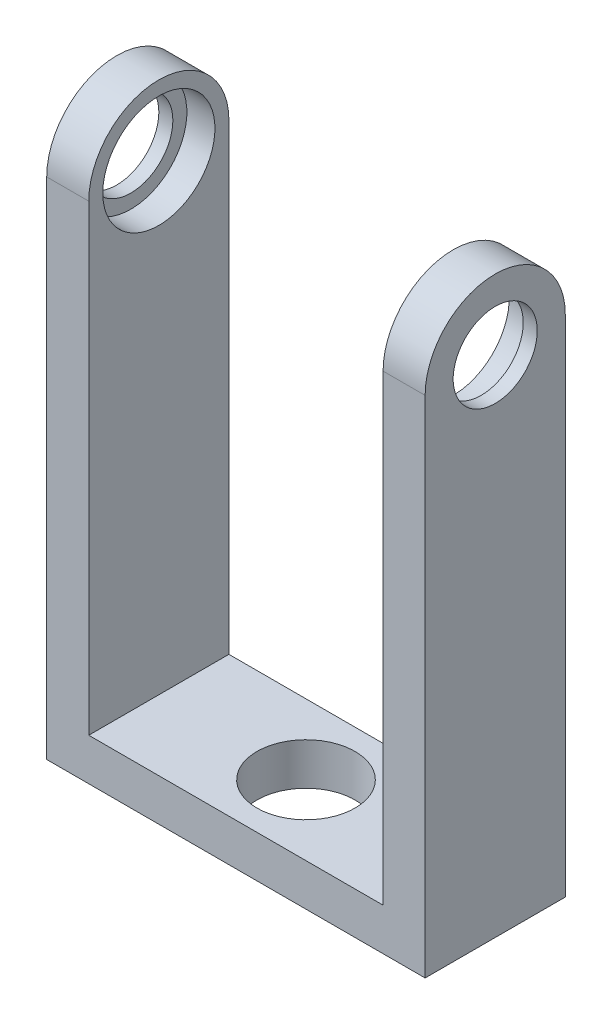
ISO-10303-21;
HEADER;
FILE_DESCRIPTION(('STEP AP214'),'2;1');
FILE_NAME('part.step','',(''),(''),'','','');
FILE_SCHEMA(('AUTOMOTIVE_DESIGN { 1 0 10303 214 1 1 1 1 }'));
ENDSEC;
DATA;
#1=APPLICATION_CONTEXT('core data for automotive mechanical design processes');
#2=APPLICATION_PROTOCOL_DEFINITION('international standard','automotive_design',2000,#1);
#3=PRODUCT_CONTEXT('',#1,'mechanical');
#4=PRODUCT('Part','Part','',(#3));
#5=PRODUCT_RELATED_PRODUCT_CATEGORY('part','',(#4));
#6=PRODUCT_DEFINITION_FORMATION('','',#4);
#7=PRODUCT_DEFINITION_CONTEXT('part definition',#1,'design');
#8=PRODUCT_DEFINITION('design','',#6,#7);
#9=PRODUCT_DEFINITION_SHAPE('','',#8);
#10=(LENGTH_UNIT() NAMED_UNIT(*) SI_UNIT(.MILLI.,.METRE.));
#11=(NAMED_UNIT(*) PLANE_ANGLE_UNIT() SI_UNIT($,.RADIAN.));
#12=(NAMED_UNIT(*) SI_UNIT($,.STERADIAN.) SOLID_ANGLE_UNIT());
#13=UNCERTAINTY_MEASURE_WITH_UNIT(LENGTH_MEASURE(1.E-05),#10,'distance_accuracy_value','');
#14=(GEOMETRIC_REPRESENTATION_CONTEXT(3) GLOBAL_UNCERTAINTY_ASSIGNED_CONTEXT((#13)) GLOBAL_UNIT_ASSIGNED_CONTEXT((#10,
#11,#12)) REPRESENTATION_CONTEXT('',''));
#15=CARTESIAN_POINT('',(0.,0.,0.));
#16=DIRECTION('',(0.,0.,1.));
#17=DIRECTION('',(1.,0.,0.));
#18=AXIS2_PLACEMENT_3D('',#15,#16,#17);
#19=CARTESIAN_POINT('',(-10.5,36.,0.));
#20=DIRECTION('',(-1.,0.,0.));
#21=DIRECTION('',(0.,0.,1.));
#22=AXIS2_PLACEMENT_3D('',#19,#20,#21);
#23=CYLINDRICAL_SURFACE('',#22,3.);
#24=CARTESIAN_POINT('',(-13.5,36.,0.));
#25=DIRECTION('',(1.,0.,0.));
#26=DIRECTION('',(0.,0.,-1.));
#27=AXIS2_PLACEMENT_3D('',#24,#25,#26);
#28=CIRCLE('',#27,3.);
#29=CARTESIAN_POINT('',(-13.5,36.,-3.));
#30=VERTEX_POINT('',#29);
#31=EDGE_CURVE('E135',#30,#30,#28,.T.);
#32=ORIENTED_EDGE('',*,*,#31,.F.);
#33=EDGE_LOOP('',(#32));
#34=FACE_BOUND('',#33,.T.);
#35=CARTESIAN_POINT('',(-12.5,36.,0.));
#36=DIRECTION('',(1.,0.,0.));
#37=DIRECTION('',(0.,0.,-1.));
#38=AXIS2_PLACEMENT_3D('',#35,#36,#37);
#39=CIRCLE('',#38,3.);
#40=CARTESIAN_POINT('',(-12.5,36.,-3.));
#41=VERTEX_POINT('',#40);
#42=EDGE_CURVE('E43',#41,#41,#39,.T.);
#43=ORIENTED_EDGE('',*,*,#42,.T.);
#44=EDGE_LOOP('',(#43));
#45=FACE_BOUND('',#44,.T.);
#46=ADVANCED_FACE('F39',(#34,#45),#23,.F.);
#47=CARTESIAN_POINT('',(10.5,36.,0.));
#48=DIRECTION('',(1.,0.,0.));
#49=DIRECTION('',(0.,0.,-1.));
#50=AXIS2_PLACEMENT_3D('',#47,#48,#49);
#51=CYLINDRICAL_SURFACE('',#50,3.);
#52=CARTESIAN_POINT('',(13.5,36.,0.));
#53=DIRECTION('',(1.,0.,0.));
#54=DIRECTION('',(0.,0.,-1.));
#55=AXIS2_PLACEMENT_3D('',#52,#53,#54);
#56=CIRCLE('',#55,3.);
#57=CARTESIAN_POINT('',(13.5,36.,-3.));
#58=VERTEX_POINT('',#57);
#59=EDGE_CURVE('E155',#58,#58,#56,.T.);
#60=ORIENTED_EDGE('',*,*,#59,.T.);
#61=EDGE_LOOP('',(#60));
#62=FACE_BOUND('',#61,.T.);
#63=CARTESIAN_POINT('',(12.5,36.,0.));
#64=DIRECTION('',(-1.,0.,0.));
#65=DIRECTION('',(0.,0.,1.));
#66=AXIS2_PLACEMENT_3D('',#63,#64,#65);
#67=CIRCLE('',#66,3.);
#68=CARTESIAN_POINT('',(12.5,36.,3.));
#69=VERTEX_POINT('',#68);
#70=EDGE_CURVE('E151',#69,#69,#67,.F.);
#71=ORIENTED_EDGE('',*,*,#70,.F.);
#72=EDGE_LOOP('',(#71));
#73=FACE_BOUND('',#72,.T.);
#74=ADVANCED_FACE('F216',(#62,#73),#51,.F.);
#75=CARTESIAN_POINT('',(13.5,3.,5.));
#76=DIRECTION('',(-1.,0.,0.));
#77=DIRECTION('',(0.,0.,1.));
#78=AXIS2_PLACEMENT_3D('',#75,#76,#77);
#79=PLANE('',#78);
#80=DIRECTION('',(0.,0.,-1.));
#81=VECTOR('',#80,1.);
#82=CARTESIAN_POINT('',(13.5,0.,5.));
#83=LINE('',#82,#81);
#84=CARTESIAN_POINT('',(13.5,0.,5.));
#85=VERTEX_POINT('',#84);
#86=CARTESIAN_POINT('',(13.5,0.,-5.));
#87=VERTEX_POINT('',#86);
#88=EDGE_CURVE('E182',#85,#87,#83,.T.);
#89=ORIENTED_EDGE('',*,*,#88,.T.);
#90=DIRECTION('',(0.,-1.,0.));
#91=VECTOR('',#90,1.);
#92=CARTESIAN_POINT('',(13.5,3.,-5.));
#93=LINE('',#92,#91);
#94=CARTESIAN_POINT('',(13.5,36.,-5.));
#95=VERTEX_POINT('',#94);
#96=EDGE_CURVE('E11',#95,#87,#93,.T.);
#97=ORIENTED_EDGE('',*,*,#96,.F.);
#98=CARTESIAN_POINT('',(13.5,36.,0.));
#99=DIRECTION('',(1.,0.,0.));
#100=DIRECTION('',(0.,0.,1.));
#101=AXIS2_PLACEMENT_3D('',#98,#99,#100);
#102=CIRCLE('',#101,5.);
#103=CARTESIAN_POINT('',(13.5,36.,5.));
#104=VERTEX_POINT('',#103);
#105=EDGE_CURVE('E159',#95,#104,#102,.T.);
#106=ORIENTED_EDGE('',*,*,#105,.T.);
#107=DIRECTION('',(0.,-1.,0.));
#108=VECTOR('',#107,1.);
#109=CARTESIAN_POINT('',(13.5,3.,5.));
#110=LINE('',#109,#108);
#111=EDGE_CURVE('E191',#104,#85,#110,.T.);
#112=ORIENTED_EDGE('',*,*,#111,.T.);
#113=EDGE_LOOP('',(#89,#97,#106,#112));
#114=FACE_BOUND('',#113,.T.);
#115=ORIENTED_EDGE('',*,*,#59,.F.);
#116=EDGE_LOOP('',(#115));
#117=FACE_BOUND('',#116,.T.);
#118=ADVANCED_FACE('F41',(#114,#117),#79,.F.);
#119=CARTESIAN_POINT('',(-13.5,3.,-5.));
#120=DIRECTION('',(0.,0.,1.));
#121=DIRECTION('',(1.,0.,0.));
#122=AXIS2_PLACEMENT_3D('',#119,#120,#121);
#123=PLANE('',#122);
#124=DIRECTION('',(-1.,0.,0.));
#125=VECTOR('',#124,1.);
#126=CARTESIAN_POINT('',(-13.5,3.,-5.));
#127=LINE('',#126,#125);
#128=CARTESIAN_POINT('',(10.5,3.,-5.));
#129=VERTEX_POINT('',#128);
#130=CARTESIAN_POINT('',(-10.5,3.,-5.));
#131=VERTEX_POINT('',#130);
#132=EDGE_CURVE('E57',#129,#131,#127,.T.);
#133=ORIENTED_EDGE('',*,*,#132,.F.);
#134=DIRECTION('',(0.,1.,0.));
#135=VECTOR('',#134,1.);
#136=CARTESIAN_POINT('',(10.5,3.,-5.));
#137=LINE('',#136,#135);
#138=CARTESIAN_POINT('',(10.5,36.,-5.));
#139=VERTEX_POINT('',#138);
#140=EDGE_CURVE('E166',#129,#139,#137,.T.);
#141=ORIENTED_EDGE('',*,*,#140,.T.);
#142=DIRECTION('',(1.,0.,0.));
#143=VECTOR('',#142,1.);
#144=CARTESIAN_POINT('',(10.5,36.,-5.));
#145=LINE('',#144,#143);
#146=EDGE_CURVE('E174',#139,#95,#145,.T.);
#147=ORIENTED_EDGE('',*,*,#146,.T.);
#148=ORIENTED_EDGE('',*,*,#96,.T.);
#149=DIRECTION('',(-1.,0.,0.));
#150=VECTOR('',#149,1.);
#151=CARTESIAN_POINT('',(-13.5,0.,-5.));
#152=LINE('',#151,#150);
#153=CARTESIAN_POINT('',(-13.5,0.,-5.));
#154=VERTEX_POINT('',#153);
#155=EDGE_CURVE('E195',#87,#154,#152,.T.);
#156=ORIENTED_EDGE('',*,*,#155,.T.);
#157=DIRECTION('',(0.,-1.,0.));
#158=VECTOR('',#157,1.);
#159=CARTESIAN_POINT('',(-13.5,3.,-5.));
#160=LINE('',#159,#158);
#161=CARTESIAN_POINT('',(-13.5,36.,-5.));
#162=VERTEX_POINT('',#161);
#163=EDGE_CURVE('E49',#162,#154,#160,.T.);
#164=ORIENTED_EDGE('',*,*,#163,.F.);
#165=DIRECTION('',(-1.,0.,0.));
#166=VECTOR('',#165,1.);
#167=CARTESIAN_POINT('',(-10.5,36.,-5.));
#168=LINE('',#167,#166);
#169=CARTESIAN_POINT('',(-10.5,36.,-5.));
#170=VERTEX_POINT('',#169);
#171=EDGE_CURVE('E126',#170,#162,#168,.T.);
#172=ORIENTED_EDGE('',*,*,#171,.F.);
#173=DIRECTION('',(0.,1.,0.));
#174=VECTOR('',#173,1.);
#175=CARTESIAN_POINT('',(-10.5,3.,-5.));
#176=LINE('',#175,#174);
#177=EDGE_CURVE('E111',#131,#170,#176,.T.);
#178=ORIENTED_EDGE('',*,*,#177,.F.);
#179=EDGE_LOOP('',(#133,#141,#147,#148,#156,#164,#172,#178));
#180=FACE_BOUND('',#179,.T.);
#181=ADVANCED_FACE('F224',(#180),#123,.F.);
#182=CARTESIAN_POINT('',(-13.5,3.,5.));
#183=DIRECTION('',(1.,0.,0.));
#184=DIRECTION('',(0.,0.,-1.));
#185=AXIS2_PLACEMENT_3D('',#182,#183,#184);
#186=PLANE('',#185);
#187=DIRECTION('',(0.,0.,1.));
#188=VECTOR('',#187,1.);
#189=CARTESIAN_POINT('',(-13.5,0.,5.));
#190=LINE('',#189,#188);
#191=CARTESIAN_POINT('',(-13.5,0.,5.));
#192=VERTEX_POINT('',#191);
#193=EDGE_CURVE('E198',#154,#192,#190,.T.);
#194=ORIENTED_EDGE('',*,*,#193,.T.);
#195=DIRECTION('',(0.,-1.,0.));
#196=VECTOR('',#195,1.);
#197=CARTESIAN_POINT('',(-13.5,3.,5.));
#198=LINE('',#197,#196);
#199=CARTESIAN_POINT('',(-13.5,36.,5.));
#200=VERTEX_POINT('',#199);
#201=EDGE_CURVE('E205',#200,#192,#198,.T.);
#202=ORIENTED_EDGE('',*,*,#201,.F.);
#203=CARTESIAN_POINT('',(-13.5,36.,0.));
#204=DIRECTION('',(1.,0.,0.));
#205=DIRECTION('',(0.,0.,1.));
#206=AXIS2_PLACEMENT_3D('',#203,#204,#205);
#207=CIRCLE('',#206,5.);
#208=EDGE_CURVE('E122',#162,#200,#207,.T.);
#209=ORIENTED_EDGE('',*,*,#208,.F.);
#210=ORIENTED_EDGE('',*,*,#163,.T.);
#211=EDGE_LOOP('',(#194,#202,#209,#210));
#212=FACE_BOUND('',#211,.T.);
#213=ORIENTED_EDGE('',*,*,#31,.T.);
#214=EDGE_LOOP('',(#213));
#215=FACE_BOUND('',#214,.T.);
#216=ADVANCED_FACE('F250',(#212,#215),#186,.F.);
#217=CARTESIAN_POINT('',(-13.5,3.,5.));
#218=DIRECTION('',(0.,0.,-1.));
#219=DIRECTION('',(-1.,0.,0.));
#220=AXIS2_PLACEMENT_3D('',#217,#218,#219);
#221=PLANE('',#220);
#222=DIRECTION('',(1.,0.,0.));
#223=VECTOR('',#222,1.);
#224=CARTESIAN_POINT('',(-13.5,0.,5.));
#225=LINE('',#224,#223);
#226=EDGE_CURVE('E188',#192,#85,#225,.T.);
#227=ORIENTED_EDGE('',*,*,#226,.T.);
#228=ORIENTED_EDGE('',*,*,#111,.F.);
#229=DIRECTION('',(1.,0.,0.));
#230=VECTOR('',#229,1.);
#231=CARTESIAN_POINT('',(10.5,36.,5.));
#232=LINE('',#231,#230);
#233=CARTESIAN_POINT('',(10.5,36.,5.));
#234=VERTEX_POINT('',#233);
#235=EDGE_CURVE('E178',#234,#104,#232,.T.);
#236=ORIENTED_EDGE('',*,*,#235,.F.);
#237=DIRECTION('',(0.,-1.,0.));
#238=VECTOR('',#237,1.);
#239=CARTESIAN_POINT('',(10.5,3.,5.));
#240=LINE('',#239,#238);
#241=CARTESIAN_POINT('',(10.5,3.,5.));
#242=VERTEX_POINT('',#241);
#243=EDGE_CURVE('E160',#234,#242,#240,.T.);
#244=ORIENTED_EDGE('',*,*,#243,.T.);
#245=DIRECTION('',(1.,0.,0.));
#246=VECTOR('',#245,1.);
#247=CARTESIAN_POINT('',(-13.5,3.,5.));
#248=LINE('',#247,#246);
#249=CARTESIAN_POINT('',(-10.5,3.,5.));
#250=VERTEX_POINT('',#249);
#251=EDGE_CURVE('E131',#250,#242,#248,.T.);
#252=ORIENTED_EDGE('',*,*,#251,.F.);
#253=DIRECTION('',(0.,-1.,0.));
#254=VECTOR('',#253,1.);
#255=CARTESIAN_POINT('',(-10.5,3.,5.));
#256=LINE('',#255,#254);
#257=CARTESIAN_POINT('',(-10.5,36.,5.));
#258=VERTEX_POINT('',#257);
#259=EDGE_CURVE('E109',#258,#250,#256,.T.);
#260=ORIENTED_EDGE('',*,*,#259,.F.);
#261=DIRECTION('',(-1.,0.,0.));
#262=VECTOR('',#261,1.);
#263=CARTESIAN_POINT('',(-10.5,36.,5.));
#264=LINE('',#263,#262);
#265=EDGE_CURVE('E119',#258,#200,#264,.T.);
#266=ORIENTED_EDGE('',*,*,#265,.T.);
#267=ORIENTED_EDGE('',*,*,#201,.T.);
#268=EDGE_LOOP('',(#227,#228,#236,#244,#252,#260,#266,#267));
#269=FACE_BOUND('',#268,.T.);
#270=ADVANCED_FACE('F129',(#269),#221,.F.);
#271=CARTESIAN_POINT('',(0.,3.,0.));
#272=DIRECTION('',(0.,-1.,0.));
#273=DIRECTION('',(0.,0.,-1.));
#274=AXIS2_PLACEMENT_3D('',#271,#272,#273);
#275=PLANE('',#274);
#276=CARTESIAN_POINT('',(0.,3.,0.));
#277=DIRECTION('',(0.,1.,0.));
#278=DIRECTION('',(0.,0.,1.));
#279=AXIS2_PLACEMENT_3D('',#276,#277,#278);
#280=CIRCLE('',#279,3.5);
#281=CARTESIAN_POINT('',(0.,3.,3.5));
#282=VERTEX_POINT('',#281);
#283=EDGE_CURVE('E288',#282,#282,#280,.T.);
#284=ORIENTED_EDGE('',*,*,#283,.F.);
#285=EDGE_LOOP('',(#284));
#286=FACE_BOUND('',#285,.T.);
#287=ORIENTED_EDGE('',*,*,#132,.T.);
#288=DIRECTION('',(0.,0.,-1.));
#289=VECTOR('',#288,1.);
#290=CARTESIAN_POINT('',(-10.5,3.,5.));
#291=LINE('',#290,#289);
#292=EDGE_CURVE('E61',#250,#131,#291,.T.);
#293=ORIENTED_EDGE('',*,*,#292,.F.);
#294=ORIENTED_EDGE('',*,*,#251,.T.);
#295=DIRECTION('',(0.,0.,-1.));
#296=VECTOR('',#295,1.);
#297=CARTESIAN_POINT('',(10.5,3.,5.));
#298=LINE('',#297,#296);
#299=EDGE_CURVE('E163',#242,#129,#298,.T.);
#300=ORIENTED_EDGE('',*,*,#299,.T.);
#301=EDGE_LOOP('',(#287,#293,#294,#300));
#302=FACE_BOUND('',#301,.T.);
#303=ADVANCED_FACE('F241',(#286,#302),#275,.F.);
#304=CARTESIAN_POINT('',(0.,0.,0.));
#305=DIRECTION('',(0.,-1.,0.));
#306=DIRECTION('',(0.,0.,-1.));
#307=AXIS2_PLACEMENT_3D('',#304,#305,#306);
#308=PLANE('',#307);
#309=CARTESIAN_POINT('',(0.,0.,0.));
#310=DIRECTION('',(0.,1.,0.));
#311=DIRECTION('',(0.,0.,1.));
#312=AXIS2_PLACEMENT_3D('',#309,#310,#311);
#313=CIRCLE('',#312,3.5);
#314=CARTESIAN_POINT('',(0.,0.,3.5));
#315=VERTEX_POINT('',#314);
#316=EDGE_CURVE('E286',#315,#315,#313,.T.);
#317=ORIENTED_EDGE('',*,*,#316,.T.);
#318=EDGE_LOOP('',(#317));
#319=FACE_BOUND('',#318,.T.);
#320=ORIENTED_EDGE('',*,*,#88,.F.);
#321=ORIENTED_EDGE('',*,*,#226,.F.);
#322=ORIENTED_EDGE('',*,*,#193,.F.);
#323=ORIENTED_EDGE('',*,*,#155,.F.);
#324=EDGE_LOOP('',(#320,#321,#322,#323));
#325=FACE_BOUND('',#324,.T.);
#326=ADVANCED_FACE('F239',(#319,#325),#308,.T.);
#327=CARTESIAN_POINT('',(10.5,36.,0.));
#328=DIRECTION('',(1.,0.,0.));
#329=DIRECTION('',(0.,0.,-1.));
#330=AXIS2_PLACEMENT_3D('',#327,#328,#329);
#331=CYLINDRICAL_SURFACE('',#330,5.);
#332=ORIENTED_EDGE('',*,*,#105,.F.);
#333=ORIENTED_EDGE('',*,*,#146,.F.);
#334=CARTESIAN_POINT('',(10.5,36.,0.));
#335=DIRECTION('',(1.,0.,0.));
#336=DIRECTION('',(0.,0.,1.));
#337=AXIS2_PLACEMENT_3D('',#334,#335,#336);
#338=CIRCLE('',#337,5.);
#339=EDGE_CURVE('E170',#139,#234,#338,.T.);
#340=ORIENTED_EDGE('',*,*,#339,.T.);
#341=ORIENTED_EDGE('',*,*,#235,.T.);
#342=EDGE_LOOP('',(#332,#333,#340,#341));
#343=FACE_BOUND('',#342,.T.);
#344=ADVANCED_FACE('F235',(#343),#331,.T.);
#345=CARTESIAN_POINT('',(10.5,36.,0.));
#346=DIRECTION('',(-1.,0.,0.));
#347=DIRECTION('',(0.,0.,1.));
#348=AXIS2_PLACEMENT_3D('',#345,#346,#347);
#349=PLANE('',#348);
#350=CARTESIAN_POINT('',(10.5,36.,0.));
#351=DIRECTION('',(-1.,0.,0.));
#352=DIRECTION('',(0.,0.,1.));
#353=AXIS2_PLACEMENT_3D('',#350,#351,#352);
#354=CIRCLE('',#353,4.);
#355=CARTESIAN_POINT('',(10.5,36.,4.));
#356=VERTEX_POINT('',#355);
#357=EDGE_CURVE('E145',#356,#356,#354,.T.);
#358=ORIENTED_EDGE('',*,*,#357,.F.);
#359=EDGE_LOOP('',(#358));
#360=FACE_BOUND('',#359,.T.);
#361=ORIENTED_EDGE('',*,*,#243,.F.);
#362=ORIENTED_EDGE('',*,*,#339,.F.);
#363=ORIENTED_EDGE('',*,*,#140,.F.);
#364=ORIENTED_EDGE('',*,*,#299,.F.);
#365=EDGE_LOOP('',(#361,#362,#363,#364));
#366=FACE_BOUND('',#365,.T.);
#367=ADVANCED_FACE('F232',(#360,#366),#349,.T.);
#368=CARTESIAN_POINT('',(12.5,36.,0.));
#369=DIRECTION('',(-1.,0.,0.));
#370=DIRECTION('',(0.,0.,1.));
#371=AXIS2_PLACEMENT_3D('',#368,#369,#370);
#372=PLANE('',#371);
#373=CARTESIAN_POINT('',(12.5,36.,0.));
#374=DIRECTION('',(-1.,0.,0.));
#375=DIRECTION('',(0.,0.,1.));
#376=AXIS2_PLACEMENT_3D('',#373,#374,#375);
#377=CIRCLE('',#376,4.);
#378=CARTESIAN_POINT('',(12.5,36.,4.));
#379=VERTEX_POINT('',#378);
#380=EDGE_CURVE('E147',#379,#379,#377,.T.);
#381=ORIENTED_EDGE('',*,*,#380,.T.);
#382=EDGE_LOOP('',(#381));
#383=FACE_BOUND('',#382,.T.);
#384=ORIENTED_EDGE('',*,*,#70,.T.);
#385=EDGE_LOOP('',(#384));
#386=FACE_BOUND('',#385,.T.);
#387=ADVANCED_FACE('F214',(#383,#386),#372,.T.);
#388=CARTESIAN_POINT('',(12.5,36.,0.));
#389=DIRECTION('',(-1.,0.,0.));
#390=DIRECTION('',(0.,0.,1.));
#391=AXIS2_PLACEMENT_3D('',#388,#389,#390);
#392=CYLINDRICAL_SURFACE('',#391,4.);
#393=ORIENTED_EDGE('',*,*,#380,.F.);
#394=EDGE_LOOP('',(#393));
#395=FACE_BOUND('',#394,.T.);
#396=ORIENTED_EDGE('',*,*,#357,.T.);
#397=EDGE_LOOP('',(#396));
#398=FACE_BOUND('',#397,.T.);
#399=ADVANCED_FACE('F230',(#395,#398),#392,.F.);
#400=CARTESIAN_POINT('',(-10.5,36.,0.));
#401=DIRECTION('',(1.,0.,0.));
#402=DIRECTION('',(0.,0.,1.));
#403=AXIS2_PLACEMENT_3D('',#400,#401,#402);
#404=PLANE('',#403);
#405=CARTESIAN_POINT('',(-10.5,36.,0.));
#406=DIRECTION('',(-1.,0.,0.));
#407=DIRECTION('',(0.,0.,1.));
#408=AXIS2_PLACEMENT_3D('',#405,#406,#407);
#409=CIRCLE('',#408,4.);
#410=CARTESIAN_POINT('',(-10.5,36.,4.));
#411=VERTEX_POINT('',#410);
#412=EDGE_CURVE('E280',#411,#411,#409,.T.);
#413=ORIENTED_EDGE('',*,*,#412,.T.);
#414=EDGE_LOOP('',(#413));
#415=FACE_BOUND('',#414,.T.);
#416=ORIENTED_EDGE('',*,*,#259,.T.);
#417=ORIENTED_EDGE('',*,*,#292,.T.);
#418=ORIENTED_EDGE('',*,*,#177,.T.);
#419=CARTESIAN_POINT('',(-10.5,36.,0.));
#420=DIRECTION('',(1.,0.,0.));
#421=DIRECTION('',(0.,0.,1.));
#422=AXIS2_PLACEMENT_3D('',#419,#420,#421);
#423=CIRCLE('',#422,5.);
#424=EDGE_CURVE('E105',#170,#258,#423,.T.);
#425=ORIENTED_EDGE('',*,*,#424,.T.);
#426=EDGE_LOOP('',(#416,#417,#418,#425));
#427=FACE_BOUND('',#426,.T.);
#428=ADVANCED_FACE('F107',(#415,#427),#404,.T.);
#429=CARTESIAN_POINT('',(-10.5,36.,0.));
#430=DIRECTION('',(-1.,0.,0.));
#431=DIRECTION('',(0.,0.,1.));
#432=AXIS2_PLACEMENT_3D('',#429,#430,#431);
#433=CYLINDRICAL_SURFACE('',#432,5.);
#434=ORIENTED_EDGE('',*,*,#208,.T.);
#435=ORIENTED_EDGE('',*,*,#265,.F.);
#436=ORIENTED_EDGE('',*,*,#424,.F.);
#437=ORIENTED_EDGE('',*,*,#171,.T.);
#438=EDGE_LOOP('',(#434,#435,#436,#437));
#439=FACE_BOUND('',#438,.T.);
#440=ADVANCED_FACE('F120',(#439),#433,.T.);
#441=CARTESIAN_POINT('',(-12.5,36.,0.));
#442=DIRECTION('',(1.,0.,0.));
#443=DIRECTION('',(0.,0.,-1.));
#444=AXIS2_PLACEMENT_3D('',#441,#442,#443);
#445=CYLINDRICAL_SURFACE('',#444,4.);
#446=CARTESIAN_POINT('',(-12.5,36.,0.));
#447=DIRECTION('',(-1.,0.,0.));
#448=DIRECTION('',(0.,0.,1.));
#449=AXIS2_PLACEMENT_3D('',#446,#447,#448);
#450=CIRCLE('',#449,4.);
#451=CARTESIAN_POINT('',(-12.5,36.,4.));
#452=VERTEX_POINT('',#451);
#453=EDGE_CURVE('E275',#452,#452,#450,.T.);
#454=ORIENTED_EDGE('',*,*,#453,.T.);
#455=EDGE_LOOP('',(#454));
#456=FACE_BOUND('',#455,.T.);
#457=ORIENTED_EDGE('',*,*,#412,.F.);
#458=EDGE_LOOP('',(#457));
#459=FACE_BOUND('',#458,.T.);
#460=ADVANCED_FACE('F305',(#456,#459),#445,.F.);
#461=CARTESIAN_POINT('',(-12.5,36.,0.));
#462=DIRECTION('',(1.,0.,0.));
#463=DIRECTION('',(0.,0.,1.));
#464=AXIS2_PLACEMENT_3D('',#461,#462,#463);
#465=PLANE('',#464);
#466=ORIENTED_EDGE('',*,*,#42,.F.);
#467=EDGE_LOOP('',(#466));
#468=FACE_BOUND('',#467,.T.);
#469=ORIENTED_EDGE('',*,*,#453,.F.);
#470=EDGE_LOOP('',(#469));
#471=FACE_BOUND('',#470,.T.);
#472=ADVANCED_FACE('F299',(#468,#471),#465,.T.);
#473=CARTESIAN_POINT('',(0.,0.,0.));
#474=DIRECTION('',(0.,1.,0.));
#475=DIRECTION('',(0.,0.,1.));
#476=AXIS2_PLACEMENT_3D('',#473,#474,#475);
#477=CYLINDRICAL_SURFACE('',#476,3.5);
#478=ORIENTED_EDGE('',*,*,#316,.F.);
#479=EDGE_LOOP('',(#478));
#480=FACE_BOUND('',#479,.T.);
#481=ORIENTED_EDGE('',*,*,#283,.T.);
#482=EDGE_LOOP('',(#481));
#483=FACE_BOUND('',#482,.T.);
#484=ADVANCED_FACE('F296',(#480,#483),#477,.F.);
#485=CLOSED_SHELL('',(#46,#74,#118,#181,#216,#270,#303,#326,#344,#367,#387,#399,#428,#440,#460,
#472,#484));
#486=MANIFOLD_SOLID_BREP('B2',#485);
#487=ADVANCED_BREP_SHAPE_REPRESENTATION('',(#18,#486),#14);
#488=SHAPE_DEFINITION_REPRESENTATION(#9,#487);
ENDSEC;
END-ISO-10303-21;
